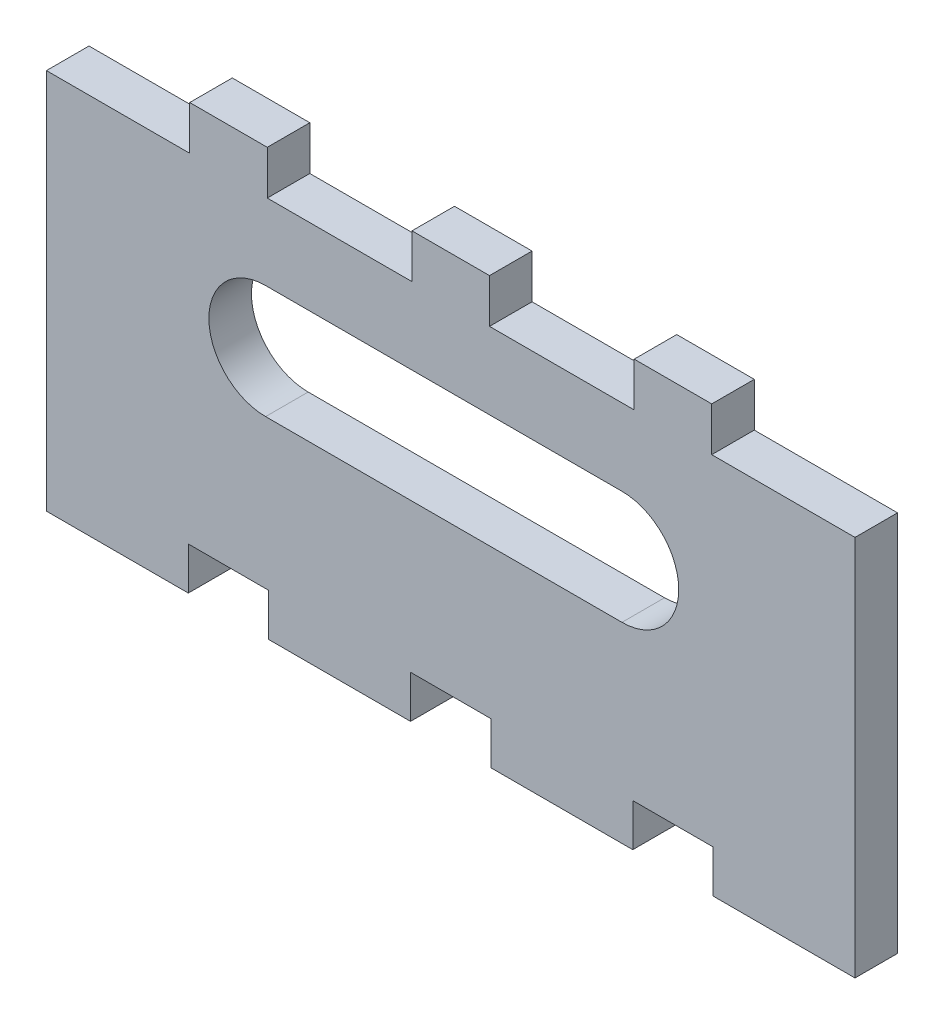
ISO-10303-21;
HEADER;
FILE_DESCRIPTION(('STEP AP214'),'2;1');
FILE_NAME('part.step','',(''),(''),'','','');
FILE_SCHEMA(('AUTOMOTIVE_DESIGN { 1 0 10303 214 1 1 1 1 }'));
ENDSEC;
DATA;
#1=APPLICATION_CONTEXT('core data for automotive mechanical design processes');
#2=APPLICATION_PROTOCOL_DEFINITION('international standard','automotive_design',2000,#1);
#3=PRODUCT_CONTEXT('',#1,'mechanical');
#4=PRODUCT('Part','Part','',(#3));
#5=PRODUCT_RELATED_PRODUCT_CATEGORY('part','',(#4));
#6=PRODUCT_DEFINITION_FORMATION('','',#4);
#7=PRODUCT_DEFINITION_CONTEXT('part definition',#1,'design');
#8=PRODUCT_DEFINITION('design','',#6,#7);
#9=PRODUCT_DEFINITION_SHAPE('','',#8);
#10=(LENGTH_UNIT() NAMED_UNIT(*) SI_UNIT(.MILLI.,.METRE.));
#11=(NAMED_UNIT(*) PLANE_ANGLE_UNIT() SI_UNIT($,.RADIAN.));
#12=(NAMED_UNIT(*) SI_UNIT($,.STERADIAN.) SOLID_ANGLE_UNIT());
#13=UNCERTAINTY_MEASURE_WITH_UNIT(LENGTH_MEASURE(1.E-05),#10,'distance_accuracy_value','');
#14=(GEOMETRIC_REPRESENTATION_CONTEXT(3) GLOBAL_UNCERTAINTY_ASSIGNED_CONTEXT((#13)) GLOBAL_UNIT_ASSIGNED_CONTEXT((#10,
#11,#12)) REPRESENTATION_CONTEXT('',''));
#15=CARTESIAN_POINT('',(0.,0.,0.));
#16=DIRECTION('',(0.,0.,1.));
#17=DIRECTION('',(1.,0.,0.));
#18=AXIS2_PLACEMENT_3D('',#15,#16,#17);
#19=CARTESIAN_POINT('',(0.,0.,-3.));
#20=DIRECTION('',(-1.,0.,0.));
#21=DIRECTION('',(0.,0.,1.));
#22=AXIS2_PLACEMENT_3D('',#19,#20,#21);
#23=PLANE('',#22);
#24=DIRECTION('',(0.,-1.,0.));
#25=VECTOR('',#24,1.);
#26=CARTESIAN_POINT('',(0.,0.,0.));
#27=LINE('',#26,#25);
#28=CARTESIAN_POINT('',(0.,23.9000000000001,0.));
#29=VERTEX_POINT('',#28);
#30=CARTESIAN_POINT('',(0.,-3.00000000000012,0.));
#31=VERTEX_POINT('',#30);
#32=EDGE_CURVE('E542',#29,#31,#27,.T.);
#33=ORIENTED_EDGE('',*,*,#32,.F.);
#34=DIRECTION('',(0.,0.,-1.));
#35=VECTOR('',#34,1.);
#36=CARTESIAN_POINT('',(0.,23.9000000000001,-3.));
#37=LINE('',#36,#35);
#38=CARTESIAN_POINT('',(0.,23.9000000000001,-3.));
#39=VERTEX_POINT('',#38);
#40=EDGE_CURVE('E327',#29,#39,#37,.T.);
#41=ORIENTED_EDGE('',*,*,#40,.T.);
#42=DIRECTION('',(0.,-1.,0.));
#43=VECTOR('',#42,1.);
#44=CARTESIAN_POINT('',(0.,0.,-3.));
#45=LINE('',#44,#43);
#46=CARTESIAN_POINT('',(0.,-3.00000000000013,-3.));
#47=VERTEX_POINT('',#46);
#48=EDGE_CURVE('E556',#39,#47,#45,.T.);
#49=ORIENTED_EDGE('',*,*,#48,.T.);
#50=DIRECTION('',(0.,0.,-1.));
#51=VECTOR('',#50,1.);
#52=CARTESIAN_POINT('',(0.,-3.00000000000012,0.));
#53=LINE('',#52,#51);
#54=EDGE_CURVE('E430',#31,#47,#53,.T.);
#55=ORIENTED_EDGE('',*,*,#54,.F.);
#56=EDGE_LOOP('',(#33,#41,#49,#55));
#57=FACE_BOUND('',#56,.T.);
#58=ADVANCED_FACE('F72',(#57),#23,.T.);
#59=CARTESIAN_POINT('',(0.,27.,-3.));
#60=DIRECTION('',(0.,1.,0.));
#61=DIRECTION('',(0.,0.,1.));
#62=AXIS2_PLACEMENT_3D('',#59,#60,#61);
#63=PLANE('',#62);
#64=DIRECTION('',(-1.,0.,0.));
#65=VECTOR('',#64,1.);
#66=CARTESIAN_POINT('',(0.,27.,0.));
#67=LINE('',#66,#65);
#68=CARTESIAN_POINT('',(46.9000000000004,27.,0.));
#69=VERTEX_POINT('',#68);
#70=CARTESIAN_POINT('',(41.4333333333337,27.,0.));
#71=VERTEX_POINT('',#70);
#72=EDGE_CURVE('E559',#69,#71,#67,.T.);
#73=ORIENTED_EDGE('',*,*,#72,.F.);
#74=DIRECTION('',(0.,0.,-1.));
#75=VECTOR('',#74,1.);
#76=CARTESIAN_POINT('',(46.9000000000004,27.,-3.));
#77=LINE('',#76,#75);
#78=CARTESIAN_POINT('',(46.9000000000004,27.,-3.));
#79=VERTEX_POINT('',#78);
#80=EDGE_CURVE('E420',#69,#79,#77,.T.);
#81=ORIENTED_EDGE('',*,*,#80,.T.);
#82=DIRECTION('',(-1.,0.,0.));
#83=VECTOR('',#82,1.);
#84=CARTESIAN_POINT('',(0.,27.,-3.));
#85=LINE('',#84,#83);
#86=CARTESIAN_POINT('',(41.4333333333337,27.,-3.));
#87=VERTEX_POINT('',#86);
#88=EDGE_CURVE('E570',#79,#87,#85,.T.);
#89=ORIENTED_EDGE('',*,*,#88,.T.);
#90=DIRECTION('',(0.,0.,1.));
#91=VECTOR('',#90,1.);
#92=CARTESIAN_POINT('',(41.4333333333337,27.,-3.));
#93=LINE('',#92,#91);
#94=EDGE_CURVE('E411',#87,#71,#93,.T.);
#95=ORIENTED_EDGE('',*,*,#94,.T.);
#96=EDGE_LOOP('',(#73,#81,#89,#95));
#97=FACE_BOUND('',#96,.T.);
#98=ADVANCED_FACE('F596',(#97),#63,.T.);
#99=CARTESIAN_POINT('',(31.2333333333337,27.,0.));
#100=VERTEX_POINT('',#99);
#101=CARTESIAN_POINT('',(25.7666666666671,27.,0.));
#102=VERTEX_POINT('',#101);
#103=EDGE_CURVE('E582',#100,#102,#67,.T.);
#104=ORIENTED_EDGE('',*,*,#103,.F.);
#105=DIRECTION('',(0.,0.,-1.));
#106=VECTOR('',#105,1.);
#107=CARTESIAN_POINT('',(31.2333333333337,27.,-3.));
#108=LINE('',#107,#106);
#109=CARTESIAN_POINT('',(31.2333333333337,27.,-3.));
#110=VERTEX_POINT('',#109);
#111=EDGE_CURVE('E414',#100,#110,#108,.T.);
#112=ORIENTED_EDGE('',*,*,#111,.T.);
#113=CARTESIAN_POINT('',(25.7666666666671,27.,-3.));
#114=VERTEX_POINT('',#113);
#115=EDGE_CURVE('E569',#110,#114,#85,.T.);
#116=ORIENTED_EDGE('',*,*,#115,.T.);
#117=DIRECTION('',(0.,0.,1.));
#118=VECTOR('',#117,1.);
#119=CARTESIAN_POINT('',(25.7666666666671,27.,-3.));
#120=LINE('',#119,#118);
#121=EDGE_CURVE('E405',#114,#102,#120,.T.);
#122=ORIENTED_EDGE('',*,*,#121,.T.);
#123=EDGE_LOOP('',(#104,#112,#116,#122));
#124=FACE_BOUND('',#123,.T.);
#125=ADVANCED_FACE('F603',(#124),#63,.T.);
#126=CARTESIAN_POINT('',(15.5666666666671,27.,0.));
#127=VERTEX_POINT('',#126);
#128=CARTESIAN_POINT('',(10.1000000000004,27.,0.));
#129=VERTEX_POINT('',#128);
#130=EDGE_CURVE('E579',#127,#129,#67,.T.);
#131=ORIENTED_EDGE('',*,*,#130,.F.);
#132=DIRECTION('',(0.,0.,-1.));
#133=VECTOR('',#132,1.);
#134=CARTESIAN_POINT('',(15.5666666666671,27.,-3.));
#135=LINE('',#134,#133);
#136=CARTESIAN_POINT('',(15.5666666666671,27.,-3.));
#137=VERTEX_POINT('',#136);
#138=EDGE_CURVE('E408',#127,#137,#135,.T.);
#139=ORIENTED_EDGE('',*,*,#138,.T.);
#140=CARTESIAN_POINT('',(10.1000000000004,27.,-3.));
#141=VERTEX_POINT('',#140);
#142=EDGE_CURVE('E566',#137,#141,#85,.T.);
#143=ORIENTED_EDGE('',*,*,#142,.T.);
#144=DIRECTION('',(0.,0.,1.));
#145=VECTOR('',#144,1.);
#146=CARTESIAN_POINT('',(10.1000000000004,27.,-3.));
#147=LINE('',#146,#145);
#148=EDGE_CURVE('E402',#141,#129,#147,.T.);
#149=ORIENTED_EDGE('',*,*,#148,.T.);
#150=EDGE_LOOP('',(#131,#139,#143,#149));
#151=FACE_BOUND('',#150,.T.);
#152=ADVANCED_FACE('F623',(#151),#63,.T.);
#153=CARTESIAN_POINT('',(57.,0.,-3.));
#154=DIRECTION('',(1.,0.,0.));
#155=DIRECTION('',(0.,0.,-1.));
#156=AXIS2_PLACEMENT_3D('',#153,#154,#155);
#157=PLANE('',#156);
#158=DIRECTION('',(0.,1.,0.));
#159=VECTOR('',#158,1.);
#160=CARTESIAN_POINT('',(57.,0.,-3.));
#161=LINE('',#160,#159);
#162=CARTESIAN_POINT('',(57.,-3.00000000000031,-3.));
#163=VERTEX_POINT('',#162);
#164=CARTESIAN_POINT('',(57.,23.8999999999999,-3.));
#165=VERTEX_POINT('',#164);
#166=EDGE_CURVE('E562',#163,#165,#161,.T.);
#167=ORIENTED_EDGE('',*,*,#166,.T.);
#168=DIRECTION('',(0.,0.,1.));
#169=VECTOR('',#168,1.);
#170=CARTESIAN_POINT('',(57.,23.8999999999999,-3.));
#171=LINE('',#170,#169);
#172=CARTESIAN_POINT('',(57.,23.8999999999999,0.));
#173=VERTEX_POINT('',#172);
#174=EDGE_CURVE('E417',#165,#173,#171,.T.);
#175=ORIENTED_EDGE('',*,*,#174,.T.);
#176=DIRECTION('',(0.,1.,0.));
#177=VECTOR('',#176,1.);
#178=CARTESIAN_POINT('',(57.,0.,0.));
#179=LINE('',#178,#177);
#180=CARTESIAN_POINT('',(57.,-3.00000000000031,0.));
#181=VERTEX_POINT('',#180);
#182=EDGE_CURVE('E575',#181,#173,#179,.T.);
#183=ORIENTED_EDGE('',*,*,#182,.F.);
#184=DIRECTION('',(0.,0.,1.));
#185=VECTOR('',#184,1.);
#186=CARTESIAN_POINT('',(57.,-3.00000000000031,-2.99999999999999));
#187=LINE('',#186,#185);
#188=EDGE_CURVE('E546',#163,#181,#187,.T.);
#189=ORIENTED_EDGE('',*,*,#188,.F.);
#190=EDGE_LOOP('',(#167,#175,#183,#189));
#191=FACE_BOUND('',#190,.T.);
#192=ADVANCED_FACE('F683',(#191),#157,.T.);
#193=CARTESIAN_POINT('',(0.,0.,-3.));
#194=DIRECTION('',(0.,0.,-1.));
#195=DIRECTION('',(-1.,0.,0.));
#196=AXIS2_PLACEMENT_3D('',#193,#194,#195);
#197=PLANE('',#196);
#198=CARTESIAN_POINT('',(15.4510094735736,14.4999999999998,-3.));
#199=DIRECTION('',(0.,0.,-1.));
#200=DIRECTION('',(-1.,0.,0.));
#201=AXIS2_PLACEMENT_3D('',#198,#199,#200);
#202=CIRCLE('',#201,4.);
#203=CARTESIAN_POINT('',(15.4510094735736,10.4999999999998,-3.));
#204=VERTEX_POINT('',#203);
#205=CARTESIAN_POINT('',(15.4510094735736,18.4999999999998,-3.));
#206=VERTEX_POINT('',#205);
#207=EDGE_CURVE('E312',#204,#206,#202,.T.);
#208=ORIENTED_EDGE('',*,*,#207,.F.);
#209=DIRECTION('',(-1.,0.,0.));
#210=VECTOR('',#209,1.);
#211=CARTESIAN_POINT('',(0.,10.4999999999998,-3.));
#212=LINE('',#211,#210);
#213=CARTESIAN_POINT('',(40.5725214914912,10.4999999999998,-3.));
#214=VERTEX_POINT('',#213);
#215=EDGE_CURVE('E305',#214,#204,#212,.T.);
#216=ORIENTED_EDGE('',*,*,#215,.F.);
#217=CARTESIAN_POINT('',(40.5725214914912,14.4999999999998,-3.));
#218=DIRECTION('',(0.,0.,-1.));
#219=DIRECTION('',(-1.,0.,0.));
#220=AXIS2_PLACEMENT_3D('',#217,#218,#219);
#221=CIRCLE('',#220,4.);
#222=CARTESIAN_POINT('',(40.5725214914912,18.4999999999998,-3.));
#223=VERTEX_POINT('',#222);
#224=EDGE_CURVE('E285',#223,#214,#221,.T.);
#225=ORIENTED_EDGE('',*,*,#224,.F.);
#226=DIRECTION('',(1.,0.,0.));
#227=VECTOR('',#226,1.);
#228=CARTESIAN_POINT('',(0.,18.4999999999998,-3.));
#229=LINE('',#228,#227);
#230=EDGE_CURVE('E310',#206,#223,#229,.T.);
#231=ORIENTED_EDGE('',*,*,#230,.F.);
#232=EDGE_LOOP('',(#208,#216,#225,#231));
#233=FACE_BOUND('',#232,.T.);
#234=ORIENTED_EDGE('',*,*,#88,.F.);
#235=DIRECTION('',(0.,1.,0.));
#236=VECTOR('',#235,1.);
#237=CARTESIAN_POINT('',(46.9000000000004,23.8999999999999,-3.));
#238=LINE('',#237,#236);
#239=CARTESIAN_POINT('',(46.9000000000004,23.8999999999999,-3.));
#240=VERTEX_POINT('',#239);
#241=EDGE_CURVE('E322',#240,#79,#238,.T.);
#242=ORIENTED_EDGE('',*,*,#241,.F.);
#243=DIRECTION('',(-1.,0.,0.));
#244=VECTOR('',#243,1.);
#245=CARTESIAN_POINT('',(57.1000000000004,23.8999999999999,-3.));
#246=LINE('',#245,#244);
#247=EDGE_CURVE('E320',#165,#240,#246,.T.);
#248=ORIENTED_EDGE('',*,*,#247,.F.);
#249=ORIENTED_EDGE('',*,*,#166,.F.);
#250=DIRECTION('',(1.,0.,0.));
#251=VECTOR('',#250,1.);
#252=CARTESIAN_POINT('',(47.,-3.00000000000028,-3.));
#253=LINE('',#252,#251);
#254=CARTESIAN_POINT('',(47.,-3.00000000000029,-3.));
#255=VERTEX_POINT('',#254);
#256=EDGE_CURVE('E549',#255,#163,#253,.T.);
#257=ORIENTED_EDGE('',*,*,#256,.F.);
#258=DIRECTION('',(0.,1.,0.));
#259=VECTOR('',#258,1.);
#260=CARTESIAN_POINT('',(47.,-6.00000000000059,-3.));
#261=LINE('',#260,#259);
#262=CARTESIAN_POINT('',(47.,0.,-3.));
#263=VERTEX_POINT('',#262);
#264=EDGE_CURVE('E535',#255,#263,#261,.T.);
#265=ORIENTED_EDGE('',*,*,#264,.T.);
#266=DIRECTION('',(1.,0.,0.));
#267=VECTOR('',#266,1.);
#268=CARTESIAN_POINT('',(0.,0.,-3.));
#269=LINE('',#268,#267);
#270=CARTESIAN_POINT('',(41.3333333333333,0.,-3.));
#271=VERTEX_POINT('',#270);
#272=EDGE_CURVE('E558',#271,#263,#269,.T.);
#273=ORIENTED_EDGE('',*,*,#272,.F.);
#274=DIRECTION('',(0.,1.,0.));
#275=VECTOR('',#274,1.);
#276=CARTESIAN_POINT('',(41.3333333333333,-6.00000000000048,-3.));
#277=LINE('',#276,#275);
#278=CARTESIAN_POINT('',(41.3333333333333,-3.00000000000026,-3.));
#279=VERTEX_POINT('',#278);
#280=EDGE_CURVE('E472',#279,#271,#277,.T.);
#281=ORIENTED_EDGE('',*,*,#280,.F.);
#282=DIRECTION('',(1.,0.,0.));
#283=VECTOR('',#282,1.);
#284=CARTESIAN_POINT('',(31.3333333333333,-3.00000000000022,-3.));
#285=LINE('',#284,#283);
#286=CARTESIAN_POINT('',(31.3333333333333,-3.00000000000024,-3.));
#287=VERTEX_POINT('',#286);
#288=EDGE_CURVE('E519',#287,#279,#285,.T.);
#289=ORIENTED_EDGE('',*,*,#288,.F.);
#290=DIRECTION('',(0.,1.,0.));
#291=VECTOR('',#290,1.);
#292=CARTESIAN_POINT('',(31.3333333333333,-6.00000000000048,-3.));
#293=LINE('',#292,#291);
#294=CARTESIAN_POINT('',(31.3333333333333,0.,-3.));
#295=VERTEX_POINT('',#294);
#296=EDGE_CURVE('E495',#287,#295,#293,.T.);
#297=ORIENTED_EDGE('',*,*,#296,.T.);
#298=CARTESIAN_POINT('',(25.6666666666667,0.,-3.));
#299=VERTEX_POINT('',#298);
#300=EDGE_CURVE('E563',#299,#295,#269,.T.);
#301=ORIENTED_EDGE('',*,*,#300,.F.);
#302=DIRECTION('',(0.,1.,0.));
#303=VECTOR('',#302,1.);
#304=CARTESIAN_POINT('',(25.6666666666667,-6.00000000000037,-3.));
#305=LINE('',#304,#303);
#306=CARTESIAN_POINT('',(25.6666666666667,-3.0000000000002,-3.));
#307=VERTEX_POINT('',#306);
#308=EDGE_CURVE('E436',#307,#299,#305,.T.);
#309=ORIENTED_EDGE('',*,*,#308,.F.);
#310=DIRECTION('',(1.,0.,0.));
#311=VECTOR('',#310,1.);
#312=CARTESIAN_POINT('',(15.6666666666667,-3.00000000000017,-3.));
#313=LINE('',#312,#311);
#314=CARTESIAN_POINT('',(15.6666666666667,-3.00000000000019,-3.));
#315=VERTEX_POINT('',#314);
#316=EDGE_CURVE('E479',#315,#307,#313,.T.);
#317=ORIENTED_EDGE('',*,*,#316,.F.);
#318=DIRECTION('',(0.,1.,0.));
#319=VECTOR('',#318,1.);
#320=CARTESIAN_POINT('',(15.6666666666667,-6.00000000000037,-3.));
#321=LINE('',#320,#319);
#322=CARTESIAN_POINT('',(15.6666666666667,0.,-3.));
#323=VERTEX_POINT('',#322);
#324=EDGE_CURVE('E455',#315,#323,#321,.T.);
#325=ORIENTED_EDGE('',*,*,#324,.T.);
#326=CARTESIAN_POINT('',(10.,0.,-3.));
#327=VERTEX_POINT('',#326);
#328=EDGE_CURVE('E560',#327,#323,#269,.T.);
#329=ORIENTED_EDGE('',*,*,#328,.F.);
#330=DIRECTION('',(0.,1.,0.));
#331=VECTOR('',#330,1.);
#332=CARTESIAN_POINT('',(10.,-6.00000000000026,-3.));
#333=LINE('',#332,#331);
#334=CARTESIAN_POINT('',(10.,-3.00000000000015,-3.));
#335=VERTEX_POINT('',#334);
#336=EDGE_CURVE('E423',#335,#327,#333,.T.);
#337=ORIENTED_EDGE('',*,*,#336,.F.);
#338=DIRECTION('',(1.,0.,0.));
#339=VECTOR('',#338,1.);
#340=CARTESIAN_POINT('',(0.,-3.00000000000011,-3.));
#341=LINE('',#340,#339);
#342=EDGE_CURVE('E443',#47,#335,#341,.T.);
#343=ORIENTED_EDGE('',*,*,#342,.F.);
#344=ORIENTED_EDGE('',*,*,#48,.F.);
#345=DIRECTION('',(-1.,0.,0.));
#346=VECTOR('',#345,1.);
#347=CARTESIAN_POINT('',(10.1000000000004,23.9000000000001,-3.));
#348=LINE('',#347,#346);
#349=CARTESIAN_POINT('',(10.1000000000004,23.9000000000001,-3.));
#350=VERTEX_POINT('',#349);
#351=EDGE_CURVE('E393',#350,#39,#348,.T.);
#352=ORIENTED_EDGE('',*,*,#351,.F.);
#353=DIRECTION('',(0.,-1.,0.));
#354=VECTOR('',#353,1.);
#355=CARTESIAN_POINT('',(10.1000000000004,27.1000000000001,-3.));
#356=LINE('',#355,#354);
#357=EDGE_CURVE('E387',#141,#350,#356,.T.);
#358=ORIENTED_EDGE('',*,*,#357,.F.);
#359=ORIENTED_EDGE('',*,*,#142,.F.);
#360=DIRECTION('',(0.,1.,0.));
#361=VECTOR('',#360,1.);
#362=CARTESIAN_POINT('',(15.5666666666671,23.9000000000001,-3.));
#363=LINE('',#362,#361);
#364=CARTESIAN_POINT('',(15.5666666666671,23.9000000000001,-3.));
#365=VERTEX_POINT('',#364);
#366=EDGE_CURVE('E380',#365,#137,#363,.T.);
#367=ORIENTED_EDGE('',*,*,#366,.F.);
#368=DIRECTION('',(-1.,0.,0.));
#369=VECTOR('',#368,1.);
#370=CARTESIAN_POINT('',(25.7666666666671,23.9,-3.));
#371=LINE('',#370,#369);
#372=CARTESIAN_POINT('',(25.7666666666671,23.9,-3.));
#373=VERTEX_POINT('',#372);
#374=EDGE_CURVE('E365',#373,#365,#371,.T.);
#375=ORIENTED_EDGE('',*,*,#374,.F.);
#376=DIRECTION('',(0.,-1.,0.));
#377=VECTOR('',#376,1.);
#378=CARTESIAN_POINT('',(25.7666666666671,27.1,-3.));
#379=LINE('',#378,#377);
#380=EDGE_CURVE('E359',#114,#373,#379,.T.);
#381=ORIENTED_EDGE('',*,*,#380,.F.);
#382=ORIENTED_EDGE('',*,*,#115,.F.);
#383=DIRECTION('',(0.,1.,0.));
#384=VECTOR('',#383,1.);
#385=CARTESIAN_POINT('',(31.2333333333337,23.9,-3.));
#386=LINE('',#385,#384);
#387=CARTESIAN_POINT('',(31.2333333333337,23.9,-3.));
#388=VERTEX_POINT('',#387);
#389=EDGE_CURVE('E352',#388,#110,#386,.T.);
#390=ORIENTED_EDGE('',*,*,#389,.F.);
#391=DIRECTION('',(-1.,0.,0.));
#392=VECTOR('',#391,1.);
#393=CARTESIAN_POINT('',(41.4333333333337,23.9,-3.));
#394=LINE('',#393,#392);
#395=CARTESIAN_POINT('',(41.4333333333337,23.9,-3.));
#396=VERTEX_POINT('',#395);
#397=EDGE_CURVE('E337',#396,#388,#394,.T.);
#398=ORIENTED_EDGE('',*,*,#397,.F.);
#399=DIRECTION('',(0.,-1.,0.));
#400=VECTOR('',#399,1.);
#401=CARTESIAN_POINT('',(41.4333333333337,27.1,-3.));
#402=LINE('',#401,#400);
#403=EDGE_CURVE('E331',#87,#396,#402,.T.);
#404=ORIENTED_EDGE('',*,*,#403,.F.);
#405=EDGE_LOOP('',(#234,#242,#248,#249,#257,#265,#273,#281,#289,#297,#301,#309,#317,#325,#329,
#337,#343,#344,#352,#358,#359,#367,#375,#381,#382,#390,#398,#404));
#406=FACE_BOUND('',#405,.T.);
#407=ADVANCED_FACE('F612',(#233,#406),#197,.T.);
#408=CARTESIAN_POINT('',(0.,0.,0.));
#409=DIRECTION('',(0.,0.,-1.));
#410=DIRECTION('',(-1.,0.,0.));
#411=AXIS2_PLACEMENT_3D('',#408,#409,#410);
#412=PLANE('',#411);
#413=DIRECTION('',(1.,0.,0.));
#414=VECTOR('',#413,1.);
#415=CARTESIAN_POINT('',(15.4510094735736,10.4999999999998,0.));
#416=LINE('',#415,#414);
#417=CARTESIAN_POINT('',(15.4510094735736,10.4999999999998,0.));
#418=VERTEX_POINT('',#417);
#419=CARTESIAN_POINT('',(40.5725214914912,10.4999999999998,0.));
#420=VERTEX_POINT('',#419);
#421=EDGE_CURVE('E291',#418,#420,#416,.T.);
#422=ORIENTED_EDGE('',*,*,#421,.F.);
#423=CARTESIAN_POINT('',(15.4510094735736,14.4999999999998,0.));
#424=DIRECTION('',(0.,0.,1.));
#425=DIRECTION('',(1.,0.,0.));
#426=AXIS2_PLACEMENT_3D('',#423,#424,#425);
#427=CIRCLE('',#426,4.);
#428=CARTESIAN_POINT('',(15.4510094735736,18.4999999999998,0.));
#429=VERTEX_POINT('',#428);
#430=EDGE_CURVE('E94',#429,#418,#427,.T.);
#431=ORIENTED_EDGE('',*,*,#430,.F.);
#432=DIRECTION('',(-1.,0.,0.));
#433=VECTOR('',#432,1.);
#434=CARTESIAN_POINT('',(15.4510094735736,18.4999999999998,0.));
#435=LINE('',#434,#433);
#436=CARTESIAN_POINT('',(40.5725214914912,18.4999999999998,0.));
#437=VERTEX_POINT('',#436);
#438=EDGE_CURVE('E298',#437,#429,#435,.T.);
#439=ORIENTED_EDGE('',*,*,#438,.F.);
#440=CARTESIAN_POINT('',(40.5725214914912,14.4999999999998,0.));
#441=DIRECTION('',(0.,0.,1.));
#442=DIRECTION('',(1.,0.,0.));
#443=AXIS2_PLACEMENT_3D('',#440,#441,#442);
#444=CIRCLE('',#443,4.);
#445=EDGE_CURVE('E282',#420,#437,#444,.T.);
#446=ORIENTED_EDGE('',*,*,#445,.F.);
#447=EDGE_LOOP('',(#422,#431,#439,#446));
#448=FACE_BOUND('',#447,.T.);
#449=CARTESIAN_POINT('',(46.9000000000004,23.8999999999999,0.));
#450=CARTESIAN_POINT('',(46.9000000000004,27.0999999999999,0.));
#451=B_SPLINE_CURVE_WITH_KNOTS('',1,(#449,#450),.UNSPECIFIED.,.F.,.F.,(2,2),(0.,
0.119402985074627),.UNSPECIFIED.);
#452=CARTESIAN_POINT('',(46.9000000000004,23.8999999999999,0.));
#453=VERTEX_POINT('',#452);
#454=EDGE_CURVE('E315',#453,#69,#451,.T.);
#455=ORIENTED_EDGE('',*,*,#454,.T.);
#456=ORIENTED_EDGE('',*,*,#72,.T.);
#457=DIRECTION('',(0.,1.,0.));
#458=VECTOR('',#457,1.);
#459=CARTESIAN_POINT('',(41.4333333333337,-1.44663710139402E-13,0.));
#460=LINE('',#459,#458);
#461=CARTESIAN_POINT('',(41.4333333333337,23.9,0.));
#462=VERTEX_POINT('',#461);
#463=EDGE_CURVE('E79',#462,#71,#460,.T.);
#464=ORIENTED_EDGE('',*,*,#463,.F.);
#465=CARTESIAN_POINT('',(41.4333333333337,23.9,0.));
#466=CARTESIAN_POINT('',(31.2333333333337,23.9,0.));
#467=B_SPLINE_CURVE_WITH_KNOTS('',1,(#465,#466),.UNSPECIFIED.,.F.,.F.,(2,2),(0.619402985074627,
1.),.UNSPECIFIED.);
#468=CARTESIAN_POINT('',(31.2333333333337,23.9,0.));
#469=VERTEX_POINT('',#468);
#470=EDGE_CURVE('E332',#462,#469,#467,.T.);
#471=ORIENTED_EDGE('',*,*,#470,.T.);
#472=CARTESIAN_POINT('',(31.2333333333337,23.9,0.));
#473=CARTESIAN_POINT('',(31.2333333333337,27.1,0.));
#474=B_SPLINE_CURVE_WITH_KNOTS('',1,(#472,#473),.UNSPECIFIED.,.F.,.F.,(2,2),(0.,
0.119402985074627),.UNSPECIFIED.);
#475=EDGE_CURVE('E339',#469,#100,#474,.T.);
#476=ORIENTED_EDGE('',*,*,#475,.T.);
#477=ORIENTED_EDGE('',*,*,#103,.T.);
#478=DIRECTION('',(0.,1.,0.));
#479=VECTOR('',#478,1.);
#480=CARTESIAN_POINT('',(25.766666666667,0.,0.));
#481=LINE('',#480,#479);
#482=CARTESIAN_POINT('',(25.7666666666671,23.9,0.));
#483=VERTEX_POINT('',#482);
#484=EDGE_CURVE('E585',#483,#102,#481,.T.);
#485=ORIENTED_EDGE('',*,*,#484,.F.);
#486=CARTESIAN_POINT('',(25.7666666666671,23.9,0.));
#487=CARTESIAN_POINT('',(15.5666666666671,23.9000000000001,0.));
#488=B_SPLINE_CURVE_WITH_KNOTS('',1,(#486,#487),.UNSPECIFIED.,.F.,.F.,(2,2),(0.619402985074627,
1.),.UNSPECIFIED.);
#489=CARTESIAN_POINT('',(15.5666666666671,23.9000000000001,0.));
#490=VERTEX_POINT('',#489);
#491=EDGE_CURVE('E360',#483,#490,#488,.T.);
#492=ORIENTED_EDGE('',*,*,#491,.T.);
#493=CARTESIAN_POINT('',(15.5666666666671,23.9000000000001,0.));
#494=CARTESIAN_POINT('',(15.5666666666671,27.1000000000001,0.));
#495=B_SPLINE_CURVE_WITH_KNOTS('',1,(#493,#494),.UNSPECIFIED.,.F.,.F.,(2,2),(0.,
0.119402985074627),.UNSPECIFIED.);
#496=EDGE_CURVE('E367',#490,#127,#495,.T.);
#497=ORIENTED_EDGE('',*,*,#496,.T.);
#498=ORIENTED_EDGE('',*,*,#130,.T.);
#499=DIRECTION('',(0.,1.,0.));
#500=VECTOR('',#499,1.);
#501=CARTESIAN_POINT('',(10.1000000000003,0.,0.));
#502=LINE('',#501,#500);
#503=CARTESIAN_POINT('',(10.1000000000004,23.9000000000001,0.));
#504=VERTEX_POINT('',#503);
#505=EDGE_CURVE('E583',#504,#129,#502,.T.);
#506=ORIENTED_EDGE('',*,*,#505,.F.);
#507=CARTESIAN_POINT('',(10.1000000000004,23.9000000000001,0.));
#508=CARTESIAN_POINT('',(-0.0999999999995865,23.9000000000001,0.));
#509=B_SPLINE_CURVE_WITH_KNOTS('',1,(#507,#508),.UNSPECIFIED.,.F.,.F.,(2,2),(0.619402985074627,
1.),.UNSPECIFIED.);
#510=EDGE_CURVE('E388',#504,#29,#509,.T.);
#511=ORIENTED_EDGE('',*,*,#510,.T.);
#512=ORIENTED_EDGE('',*,*,#32,.T.);
#513=DIRECTION('',(-1.,0.,0.));
#514=VECTOR('',#513,1.);
#515=CARTESIAN_POINT('',(10.,-3.00000000000016,0.));
#516=LINE('',#515,#514);
#517=CARTESIAN_POINT('',(10.,-3.00000000000014,0.));
#518=VERTEX_POINT('',#517);
#519=EDGE_CURVE('E437',#518,#31,#516,.T.);
#520=ORIENTED_EDGE('',*,*,#519,.F.);
#521=DIRECTION('',(0.,1.,0.));
#522=VECTOR('',#521,1.);
#523=CARTESIAN_POINT('',(10.,-6.00000000000026,0.));
#524=LINE('',#523,#522);
#525=CARTESIAN_POINT('',(10.,0.,0.));
#526=VERTEX_POINT('',#525);
#527=EDGE_CURVE('E429',#518,#526,#524,.T.);
#528=ORIENTED_EDGE('',*,*,#527,.T.);
#529=DIRECTION('',(1.,0.,0.));
#530=VECTOR('',#529,1.);
#531=CARTESIAN_POINT('',(0.,0.,0.));
#532=LINE('',#531,#530);
#533=CARTESIAN_POINT('',(15.6666666666667,0.,0.));
#534=VERTEX_POINT('',#533);
#535=EDGE_CURVE('E573',#526,#534,#532,.T.);
#536=ORIENTED_EDGE('',*,*,#535,.T.);
#537=DIRECTION('',(0.,1.,0.));
#538=VECTOR('',#537,1.);
#539=CARTESIAN_POINT('',(15.6666666666667,-6.00000000000037,0.));
#540=LINE('',#539,#538);
#541=CARTESIAN_POINT('',(15.6666666666667,-3.00000000000017,0.));
#542=VERTEX_POINT('',#541);
#543=EDGE_CURVE('E456',#542,#534,#540,.T.);
#544=ORIENTED_EDGE('',*,*,#543,.F.);
#545=DIRECTION('',(-1.,0.,0.));
#546=VECTOR('',#545,1.);
#547=CARTESIAN_POINT('',(25.6666666666667,-3.00000000000021,0.));
#548=LINE('',#547,#546);
#549=CARTESIAN_POINT('',(25.6666666666667,-3.0000000000002,0.));
#550=VERTEX_POINT('',#549);
#551=EDGE_CURVE('E473',#550,#542,#548,.T.);
#552=ORIENTED_EDGE('',*,*,#551,.F.);
#553=DIRECTION('',(0.,1.,0.));
#554=VECTOR('',#553,1.);
#555=CARTESIAN_POINT('',(25.6666666666667,-6.00000000000037,0.));
#556=LINE('',#555,#554);
#557=CARTESIAN_POINT('',(25.6666666666667,0.,0.));
#558=VERTEX_POINT('',#557);
#559=EDGE_CURVE('E465',#550,#558,#556,.T.);
#560=ORIENTED_EDGE('',*,*,#559,.T.);
#561=CARTESIAN_POINT('',(31.3333333333333,0.,0.));
#562=VERTEX_POINT('',#561);
#563=EDGE_CURVE('E576',#558,#562,#532,.T.);
#564=ORIENTED_EDGE('',*,*,#563,.T.);
#565=DIRECTION('',(0.,1.,0.));
#566=VECTOR('',#565,1.);
#567=CARTESIAN_POINT('',(31.3333333333333,-6.00000000000048,0.));
#568=LINE('',#567,#566);
#569=CARTESIAN_POINT('',(31.3333333333333,-3.00000000000023,0.));
#570=VERTEX_POINT('',#569);
#571=EDGE_CURVE('E496',#570,#562,#568,.T.);
#572=ORIENTED_EDGE('',*,*,#571,.F.);
#573=DIRECTION('',(-1.,0.,0.));
#574=VECTOR('',#573,1.);
#575=CARTESIAN_POINT('',(41.3333333333333,-3.00000000000027,0.));
#576=LINE('',#575,#574);
#577=CARTESIAN_POINT('',(41.3333333333333,-3.00000000000025,0.));
#578=VERTEX_POINT('',#577);
#579=EDGE_CURVE('E513',#578,#570,#576,.T.);
#580=ORIENTED_EDGE('',*,*,#579,.F.);
#581=DIRECTION('',(0.,1.,0.));
#582=VECTOR('',#581,1.);
#583=CARTESIAN_POINT('',(41.3333333333333,-6.00000000000048,0.));
#584=LINE('',#583,#582);
#585=CARTESIAN_POINT('',(41.3333333333333,0.,0.));
#586=VERTEX_POINT('',#585);
#587=EDGE_CURVE('E505',#578,#586,#584,.T.);
#588=ORIENTED_EDGE('',*,*,#587,.T.);
#589=CARTESIAN_POINT('',(47.,0.,0.));
#590=VERTEX_POINT('',#589);
#591=EDGE_CURVE('E572',#586,#590,#532,.T.);
#592=ORIENTED_EDGE('',*,*,#591,.T.);
#593=DIRECTION('',(0.,1.,0.));
#594=VECTOR('',#593,1.);
#595=CARTESIAN_POINT('',(47.,-6.00000000000059,0.));
#596=LINE('',#595,#594);
#597=CARTESIAN_POINT('',(47.,-3.00000000000028,0.));
#598=VERTEX_POINT('',#597);
#599=EDGE_CURVE('E512',#598,#590,#596,.T.);
#600=ORIENTED_EDGE('',*,*,#599,.F.);
#601=DIRECTION('',(-1.,0.,0.));
#602=VECTOR('',#601,1.);
#603=CARTESIAN_POINT('',(57.,-3.00000000000032,0.));
#604=LINE('',#603,#602);
#605=EDGE_CURVE('E543',#181,#598,#604,.T.);
#606=ORIENTED_EDGE('',*,*,#605,.F.);
#607=ORIENTED_EDGE('',*,*,#182,.T.);
#608=DIRECTION('',(1.,0.,0.));
#609=VECTOR('',#608,1.);
#610=CARTESIAN_POINT('',(0.,23.9000000000001,0.));
#611=LINE('',#610,#609);
#612=EDGE_CURVE('E13',#453,#173,#611,.T.);
#613=ORIENTED_EDGE('',*,*,#612,.F.);
#614=EDGE_LOOP('',(#455,#456,#464,#471,#476,#477,#485,#492,#497,#498,#506,#511,#512,#520,#528,
#536,#544,#552,#560,#564,#572,#580,#588,#592,#600,#606,#607,#613));
#615=FACE_BOUND('',#614,.T.);
#616=ADVANCED_FACE('F295',(#448,#615),#412,.F.);
#617=CARTESIAN_POINT('',(0.,0.,-3.));
#618=DIRECTION('',(0.,-1.,0.));
#619=DIRECTION('',(0.,0.,-1.));
#620=AXIS2_PLACEMENT_3D('',#617,#618,#619);
#621=PLANE('',#620);
#622=CARTESIAN_POINT('',(25.6666666666667,0.,-3.));
#623=CARTESIAN_POINT('',(25.6666666666667,0.,0.));
#624=B_SPLINE_CURVE_WITH_KNOTS('',1,(#622,#623),.UNSPECIFIED.,.F.,.F.,(2,2),(0.,
0.115384615384615),.UNSPECIFIED.);
#625=EDGE_CURVE('E457',#299,#558,#624,.T.);
#626=ORIENTED_EDGE('',*,*,#625,.F.);
#627=ORIENTED_EDGE('',*,*,#300,.T.);
#628=CARTESIAN_POINT('',(31.3333333333333,0.,0.));
#629=CARTESIAN_POINT('',(31.3333333333333,0.,-3.));
#630=B_SPLINE_CURVE_WITH_KNOTS('',1,(#628,#629),.UNSPECIFIED.,.F.,.F.,(2,2),(0.5,
0.615384615384615),.UNSPECIFIED.);
#631=EDGE_CURVE('E490',#562,#295,#630,.T.);
#632=ORIENTED_EDGE('',*,*,#631,.F.);
#633=ORIENTED_EDGE('',*,*,#563,.F.);
#634=EDGE_LOOP('',(#626,#627,#632,#633));
#635=FACE_BOUND('',#634,.T.);
#636=ADVANCED_FACE('F659',(#635),#621,.T.);
#637=CARTESIAN_POINT('',(41.3333333333333,0.,-3.));
#638=CARTESIAN_POINT('',(41.3333333333333,0.,0.));
#639=B_SPLINE_CURVE_WITH_KNOTS('',1,(#637,#638),.UNSPECIFIED.,.F.,.F.,(2,2),(0.,
0.115384615384615),.UNSPECIFIED.);
#640=EDGE_CURVE('E497',#271,#586,#639,.T.);
#641=ORIENTED_EDGE('',*,*,#640,.F.);
#642=ORIENTED_EDGE('',*,*,#272,.T.);
#643=CARTESIAN_POINT('',(47.,0.,0.));
#644=CARTESIAN_POINT('',(47.,0.,-3.));
#645=B_SPLINE_CURVE_WITH_KNOTS('',1,(#643,#644),.UNSPECIFIED.,.F.,.F.,(2,2),(0.5,
0.615384615384615),.UNSPECIFIED.);
#646=EDGE_CURVE('E530',#590,#263,#645,.T.);
#647=ORIENTED_EDGE('',*,*,#646,.F.);
#648=ORIENTED_EDGE('',*,*,#591,.F.);
#649=EDGE_LOOP('',(#641,#642,#647,#648));
#650=FACE_BOUND('',#649,.T.);
#651=ADVANCED_FACE('F672',(#650),#621,.T.);
#652=CARTESIAN_POINT('',(10.,0.,-3.));
#653=CARTESIAN_POINT('',(10.,0.,0.));
#654=B_SPLINE_CURVE_WITH_KNOTS('',1,(#652,#653),.UNSPECIFIED.,.F.,.F.,(2,2),(0.,
0.115384615384615),.UNSPECIFIED.);
#655=EDGE_CURVE('E424',#327,#526,#654,.T.);
#656=ORIENTED_EDGE('',*,*,#655,.F.);
#657=ORIENTED_EDGE('',*,*,#328,.T.);
#658=CARTESIAN_POINT('',(15.6666666666667,0.,0.));
#659=CARTESIAN_POINT('',(15.6666666666667,0.,-3.));
#660=B_SPLINE_CURVE_WITH_KNOTS('',1,(#658,#659),.UNSPECIFIED.,.F.,.F.,(2,2),(0.5,
0.615384615384615),.UNSPECIFIED.);
#661=EDGE_CURVE('E450',#534,#323,#660,.T.);
#662=ORIENTED_EDGE('',*,*,#661,.F.);
#663=ORIENTED_EDGE('',*,*,#535,.F.);
#664=EDGE_LOOP('',(#656,#657,#662,#663));
#665=FACE_BOUND('',#664,.T.);
#666=ADVANCED_FACE('F647',(#665),#621,.T.);
#667=CARTESIAN_POINT('',(47.,-6.00000000000059,0.));
#668=DIRECTION('',(1.,0.,0.));
#669=DIRECTION('',(0.,0.,-1.));
#670=AXIS2_PLACEMENT_3D('',#667,#668,#669);
#671=PLANE('',#670);
#672=DIRECTION('',(0.,0.,-1.));
#673=VECTOR('',#672,1.);
#674=CARTESIAN_POINT('',(47.,-3.00000000000029,0.));
#675=LINE('',#674,#673);
#676=EDGE_CURVE('E536',#598,#255,#675,.T.);
#677=ORIENTED_EDGE('',*,*,#676,.F.);
#678=ORIENTED_EDGE('',*,*,#599,.T.);
#679=ORIENTED_EDGE('',*,*,#646,.T.);
#680=ORIENTED_EDGE('',*,*,#264,.F.);
#681=EDGE_LOOP('',(#677,#678,#679,#680));
#682=FACE_BOUND('',#681,.T.);
#683=ADVANCED_FACE('F676',(#682),#671,.F.);
#684=CARTESIAN_POINT('',(60.0000000000007,-3.00000000000033,0.));
#685=DIRECTION('',(0.,-1.,0.));
#686=DIRECTION('',(0.,0.,1.));
#687=AXIS2_PLACEMENT_3D('',#684,#685,#686);
#688=PLANE('',#687);
#689=ORIENTED_EDGE('',*,*,#256,.T.);
#690=ORIENTED_EDGE('',*,*,#188,.T.);
#691=ORIENTED_EDGE('',*,*,#605,.T.);
#692=ORIENTED_EDGE('',*,*,#676,.T.);
#693=EDGE_LOOP('',(#689,#690,#691,#692));
#694=FACE_BOUND('',#693,.T.);
#695=ADVANCED_FACE('F680',(#694),#688,.T.);
#696=CARTESIAN_POINT('',(41.3333333333333,-6.00000000000048,-3.));
#697=DIRECTION('',(-1.,0.,0.));
#698=DIRECTION('',(0.,0.,1.));
#699=AXIS2_PLACEMENT_3D('',#696,#697,#698);
#700=PLANE('',#699);
#701=DIRECTION('',(0.,0.,1.));
#702=VECTOR('',#701,1.);
#703=CARTESIAN_POINT('',(41.3333333333333,-3.00000000000026,-2.99999999999999));
#704=LINE('',#703,#702);
#705=EDGE_CURVE('E516',#279,#578,#704,.T.);
#706=ORIENTED_EDGE('',*,*,#705,.F.);
#707=ORIENTED_EDGE('',*,*,#280,.T.);
#708=ORIENTED_EDGE('',*,*,#640,.T.);
#709=ORIENTED_EDGE('',*,*,#587,.F.);
#710=EDGE_LOOP('',(#706,#707,#708,#709));
#711=FACE_BOUND('',#710,.T.);
#712=ADVANCED_FACE('F669',(#711),#700,.F.);
#713=CARTESIAN_POINT('',(31.3333333333333,-6.00000000000048,0.));
#714=DIRECTION('',(1.,0.,0.));
#715=DIRECTION('',(0.,0.,-1.));
#716=AXIS2_PLACEMENT_3D('',#713,#714,#715);
#717=PLANE('',#716);
#718=DIRECTION('',(0.,0.,-1.));
#719=VECTOR('',#718,1.);
#720=CARTESIAN_POINT('',(31.3333333333333,-3.00000000000023,0.));
#721=LINE('',#720,#719);
#722=EDGE_CURVE('E506',#570,#287,#721,.T.);
#723=ORIENTED_EDGE('',*,*,#722,.F.);
#724=ORIENTED_EDGE('',*,*,#571,.T.);
#725=ORIENTED_EDGE('',*,*,#631,.T.);
#726=ORIENTED_EDGE('',*,*,#296,.F.);
#727=EDGE_LOOP('',(#723,#724,#725,#726));
#728=FACE_BOUND('',#727,.T.);
#729=ADVANCED_FACE('F662',(#728),#717,.F.);
#730=CARTESIAN_POINT('',(60.0000000000007,-3.00000000000033,0.));
#731=DIRECTION('',(0.,-1.,0.));
#732=DIRECTION('',(0.,0.,1.));
#733=AXIS2_PLACEMENT_3D('',#730,#731,#732);
#734=PLANE('',#733);
#735=ORIENTED_EDGE('',*,*,#288,.T.);
#736=ORIENTED_EDGE('',*,*,#705,.T.);
#737=ORIENTED_EDGE('',*,*,#579,.T.);
#738=ORIENTED_EDGE('',*,*,#722,.T.);
#739=EDGE_LOOP('',(#735,#736,#737,#738));
#740=FACE_BOUND('',#739,.T.);
#741=ADVANCED_FACE('F665',(#740),#734,.T.);
#742=CARTESIAN_POINT('',(25.6666666666667,-6.00000000000037,-3.));
#743=DIRECTION('',(-1.,0.,0.));
#744=DIRECTION('',(0.,0.,1.));
#745=AXIS2_PLACEMENT_3D('',#742,#743,#744);
#746=PLANE('',#745);
#747=DIRECTION('',(0.,0.,1.));
#748=VECTOR('',#747,1.);
#749=CARTESIAN_POINT('',(25.6666666666667,-3.0000000000002,-2.99999999999999));
#750=LINE('',#749,#748);
#751=EDGE_CURVE('E476',#307,#550,#750,.T.);
#752=ORIENTED_EDGE('',*,*,#751,.F.);
#753=ORIENTED_EDGE('',*,*,#308,.T.);
#754=ORIENTED_EDGE('',*,*,#625,.T.);
#755=ORIENTED_EDGE('',*,*,#559,.F.);
#756=EDGE_LOOP('',(#752,#753,#754,#755));
#757=FACE_BOUND('',#756,.T.);
#758=ADVANCED_FACE('F655',(#757),#746,.F.);
#759=CARTESIAN_POINT('',(15.6666666666667,-6.00000000000037,0.));
#760=DIRECTION('',(1.,0.,0.));
#761=DIRECTION('',(0.,0.,-1.));
#762=AXIS2_PLACEMENT_3D('',#759,#760,#761);
#763=PLANE('',#762);
#764=DIRECTION('',(0.,0.,-1.));
#765=VECTOR('',#764,1.);
#766=CARTESIAN_POINT('',(15.6666666666667,-3.00000000000018,0.));
#767=LINE('',#766,#765);
#768=EDGE_CURVE('E466',#542,#315,#767,.T.);
#769=ORIENTED_EDGE('',*,*,#768,.F.);
#770=ORIENTED_EDGE('',*,*,#543,.T.);
#771=ORIENTED_EDGE('',*,*,#661,.T.);
#772=ORIENTED_EDGE('',*,*,#324,.F.);
#773=EDGE_LOOP('',(#769,#770,#771,#772));
#774=FACE_BOUND('',#773,.T.);
#775=ADVANCED_FACE('F746',(#774),#763,.F.);
#776=CARTESIAN_POINT('',(60.0000000000007,-3.00000000000033,0.));
#777=DIRECTION('',(0.,-1.,0.));
#778=DIRECTION('',(0.,0.,1.));
#779=AXIS2_PLACEMENT_3D('',#776,#777,#778);
#780=PLANE('',#779);
#781=ORIENTED_EDGE('',*,*,#316,.T.);
#782=ORIENTED_EDGE('',*,*,#751,.T.);
#783=ORIENTED_EDGE('',*,*,#551,.T.);
#784=ORIENTED_EDGE('',*,*,#768,.T.);
#785=EDGE_LOOP('',(#781,#782,#783,#784));
#786=FACE_BOUND('',#785,.T.);
#787=ADVANCED_FACE('F652',(#786),#780,.T.);
#788=CARTESIAN_POINT('',(10.,-6.00000000000026,-3.));
#789=DIRECTION('',(-1.,0.,0.));
#790=DIRECTION('',(0.,0.,1.));
#791=AXIS2_PLACEMENT_3D('',#788,#789,#790);
#792=PLANE('',#791);
#793=DIRECTION('',(0.,0.,1.));
#794=VECTOR('',#793,1.);
#795=CARTESIAN_POINT('',(10.,-3.00000000000015,-2.99999999999999));
#796=LINE('',#795,#794);
#797=EDGE_CURVE('E440',#335,#518,#796,.T.);
#798=ORIENTED_EDGE('',*,*,#797,.F.);
#799=ORIENTED_EDGE('',*,*,#336,.T.);
#800=ORIENTED_EDGE('',*,*,#655,.T.);
#801=ORIENTED_EDGE('',*,*,#527,.F.);
#802=EDGE_LOOP('',(#798,#799,#800,#801));
#803=FACE_BOUND('',#802,.T.);
#804=ADVANCED_FACE('F641',(#803),#792,.F.);
#805=CARTESIAN_POINT('',(60.0000000000007,-3.00000000000033,0.));
#806=DIRECTION('',(0.,-1.,0.));
#807=DIRECTION('',(0.,0.,1.));
#808=AXIS2_PLACEMENT_3D('',#805,#806,#807);
#809=PLANE('',#808);
#810=ORIENTED_EDGE('',*,*,#342,.T.);
#811=ORIENTED_EDGE('',*,*,#797,.T.);
#812=ORIENTED_EDGE('',*,*,#519,.T.);
#813=ORIENTED_EDGE('',*,*,#54,.T.);
#814=EDGE_LOOP('',(#810,#811,#812,#813));
#815=FACE_BOUND('',#814,.T.);
#816=ADVANCED_FACE('F642',(#815),#809,.T.);
#817=CARTESIAN_POINT('',(10.1000000000004,27.1000000000001,-5.99999999999999));
#818=DIRECTION('',(-1.,0.,0.));
#819=DIRECTION('',(0.,1.,0.));
#820=AXIS2_PLACEMENT_3D('',#817,#818,#819);
#821=PLANE('',#820);
#822=ORIENTED_EDGE('',*,*,#357,.T.);
#823=DIRECTION('',(0.,0.,1.));
#824=VECTOR('',#823,1.);
#825=CARTESIAN_POINT('',(10.1000000000004,23.9000000000001,-5.99999999999999));
#826=LINE('',#825,#824);
#827=EDGE_CURVE('E314',#350,#504,#826,.T.);
#828=ORIENTED_EDGE('',*,*,#827,.T.);
#829=ORIENTED_EDGE('',*,*,#505,.T.);
#830=ORIENTED_EDGE('',*,*,#148,.F.);
#831=EDGE_LOOP('',(#822,#828,#829,#830));
#832=FACE_BOUND('',#831,.T.);
#833=ADVANCED_FACE('F626',(#832),#821,.T.);
#834=CARTESIAN_POINT('',(10.1000000000004,23.9000000000001,-5.99999999999999));
#835=DIRECTION('',(0.,1.,0.));
#836=DIRECTION('',(0.,0.,-1.));
#837=AXIS2_PLACEMENT_3D('',#834,#835,#836);
#838=PLANE('',#837);
#839=ORIENTED_EDGE('',*,*,#510,.F.);
#840=ORIENTED_EDGE('',*,*,#827,.F.);
#841=ORIENTED_EDGE('',*,*,#351,.T.);
#842=ORIENTED_EDGE('',*,*,#40,.F.);
#843=EDGE_LOOP('',(#839,#840,#841,#842));
#844=FACE_BOUND('',#843,.T.);
#845=ADVANCED_FACE('F633',(#844),#838,.T.);
#846=CARTESIAN_POINT('',(15.5666666666671,23.9000000000001,-5.99999999999999));
#847=DIRECTION('',(1.,0.,0.));
#848=DIRECTION('',(0.,-1.,0.));
#849=AXIS2_PLACEMENT_3D('',#846,#847,#848);
#850=PLANE('',#849);
#851=ORIENTED_EDGE('',*,*,#496,.F.);
#852=DIRECTION('',(0.,0.,1.));
#853=VECTOR('',#852,1.);
#854=CARTESIAN_POINT('',(15.5666666666671,23.9000000000001,-5.99999999999999));
#855=LINE('',#854,#853);
#856=EDGE_CURVE('E375',#365,#490,#855,.T.);
#857=ORIENTED_EDGE('',*,*,#856,.F.);
#858=ORIENTED_EDGE('',*,*,#366,.T.);
#859=ORIENTED_EDGE('',*,*,#138,.F.);
#860=EDGE_LOOP('',(#851,#857,#858,#859));
#861=FACE_BOUND('',#860,.T.);
#862=ADVANCED_FACE('F759',(#861),#850,.T.);
#863=CARTESIAN_POINT('',(25.7666666666671,27.1,-5.99999999999999));
#864=DIRECTION('',(-1.,0.,0.));
#865=DIRECTION('',(0.,1.,0.));
#866=AXIS2_PLACEMENT_3D('',#863,#864,#865);
#867=PLANE('',#866);
#868=ORIENTED_EDGE('',*,*,#380,.T.);
#869=DIRECTION('',(0.,0.,1.));
#870=VECTOR('',#869,1.);
#871=CARTESIAN_POINT('',(25.7666666666671,23.9,-5.99999999999999));
#872=LINE('',#871,#870);
#873=EDGE_CURVE('E366',#373,#483,#872,.T.);
#874=ORIENTED_EDGE('',*,*,#873,.T.);
#875=ORIENTED_EDGE('',*,*,#484,.T.);
#876=ORIENTED_EDGE('',*,*,#121,.F.);
#877=EDGE_LOOP('',(#868,#874,#875,#876));
#878=FACE_BOUND('',#877,.T.);
#879=ADVANCED_FACE('F608',(#878),#867,.T.);
#880=CARTESIAN_POINT('',(25.7666666666671,23.9,-5.99999999999999));
#881=DIRECTION('',(0.,1.,0.));
#882=DIRECTION('',(0.,0.,-1.));
#883=AXIS2_PLACEMENT_3D('',#880,#881,#882);
#884=PLANE('',#883);
#885=ORIENTED_EDGE('',*,*,#374,.T.);
#886=ORIENTED_EDGE('',*,*,#856,.T.);
#887=ORIENTED_EDGE('',*,*,#491,.F.);
#888=ORIENTED_EDGE('',*,*,#873,.F.);
#889=EDGE_LOOP('',(#885,#886,#887,#888));
#890=FACE_BOUND('',#889,.T.);
#891=ADVANCED_FACE('F617',(#890),#884,.T.);
#892=CARTESIAN_POINT('',(31.2333333333337,23.9,-5.99999999999999));
#893=DIRECTION('',(1.,0.,0.));
#894=DIRECTION('',(0.,-1.,0.));
#895=AXIS2_PLACEMENT_3D('',#892,#893,#894);
#896=PLANE('',#895);
#897=ORIENTED_EDGE('',*,*,#475,.F.);
#898=DIRECTION('',(0.,0.,1.));
#899=VECTOR('',#898,1.);
#900=CARTESIAN_POINT('',(31.2333333333337,23.9,-5.99999999999999));
#901=LINE('',#900,#899);
#902=EDGE_CURVE('E347',#388,#469,#901,.T.);
#903=ORIENTED_EDGE('',*,*,#902,.F.);
#904=ORIENTED_EDGE('',*,*,#389,.T.);
#905=ORIENTED_EDGE('',*,*,#111,.F.);
#906=EDGE_LOOP('',(#897,#903,#904,#905));
#907=FACE_BOUND('',#906,.T.);
#908=ADVANCED_FACE('F695',(#907),#896,.T.);
#909=CARTESIAN_POINT('',(41.4333333333337,27.1,-5.99999999999999));
#910=DIRECTION('',(-1.,0.,0.));
#911=DIRECTION('',(0.,1.,0.));
#912=AXIS2_PLACEMENT_3D('',#909,#910,#911);
#913=PLANE('',#912);
#914=ORIENTED_EDGE('',*,*,#403,.T.);
#915=DIRECTION('',(0.,0.,1.));
#916=VECTOR('',#915,1.);
#917=CARTESIAN_POINT('',(41.4333333333337,23.9,-5.99999999999999));
#918=LINE('',#917,#916);
#919=EDGE_CURVE('E338',#396,#462,#918,.T.);
#920=ORIENTED_EDGE('',*,*,#919,.T.);
#921=ORIENTED_EDGE('',*,*,#463,.T.);
#922=ORIENTED_EDGE('',*,*,#94,.F.);
#923=EDGE_LOOP('',(#914,#920,#921,#922));
#924=FACE_BOUND('',#923,.T.);
#925=ADVANCED_FACE('F588',(#924),#913,.T.);
#926=CARTESIAN_POINT('',(41.4333333333337,23.9,-5.99999999999999));
#927=DIRECTION('',(0.,1.,0.));
#928=DIRECTION('',(0.,0.,-1.));
#929=AXIS2_PLACEMENT_3D('',#926,#927,#928);
#930=PLANE('',#929);
#931=ORIENTED_EDGE('',*,*,#397,.T.);
#932=ORIENTED_EDGE('',*,*,#902,.T.);
#933=ORIENTED_EDGE('',*,*,#470,.F.);
#934=ORIENTED_EDGE('',*,*,#919,.F.);
#935=EDGE_LOOP('',(#931,#932,#933,#934));
#936=FACE_BOUND('',#935,.T.);
#937=ADVANCED_FACE('F693',(#936),#930,.T.);
#938=CARTESIAN_POINT('',(46.9000000000004,23.8999999999999,-5.99999999999999));
#939=DIRECTION('',(1.,0.,0.));
#940=DIRECTION('',(0.,-1.,0.));
#941=AXIS2_PLACEMENT_3D('',#938,#939,#940);
#942=PLANE('',#941);
#943=ORIENTED_EDGE('',*,*,#454,.F.);
#944=DIRECTION('',(0.,0.,1.));
#945=VECTOR('',#944,1.);
#946=CARTESIAN_POINT('',(46.9000000000004,23.8999999999999,-5.99999999999999));
#947=LINE('',#946,#945);
#948=EDGE_CURVE('E321',#240,#453,#947,.T.);
#949=ORIENTED_EDGE('',*,*,#948,.F.);
#950=ORIENTED_EDGE('',*,*,#241,.T.);
#951=ORIENTED_EDGE('',*,*,#80,.F.);
#952=EDGE_LOOP('',(#943,#949,#950,#951));
#953=FACE_BOUND('',#952,.T.);
#954=ADVANCED_FACE('F690',(#953),#942,.T.);
#955=CARTESIAN_POINT('',(57.1000000000004,23.8999999999999,-5.99999999999999));
#956=DIRECTION('',(0.,1.,0.));
#957=DIRECTION('',(0.,0.,-1.));
#958=AXIS2_PLACEMENT_3D('',#955,#956,#957);
#959=PLANE('',#958);
#960=ORIENTED_EDGE('',*,*,#247,.T.);
#961=ORIENTED_EDGE('',*,*,#948,.T.);
#962=ORIENTED_EDGE('',*,*,#612,.T.);
#963=ORIENTED_EDGE('',*,*,#174,.F.);
#964=EDGE_LOOP('',(#960,#961,#962,#963));
#965=FACE_BOUND('',#964,.T.);
#966=ADVANCED_FACE('F685',(#965),#959,.T.);
#967=CARTESIAN_POINT('',(15.4510094735736,14.4999999999998,-10.));
#968=DIRECTION('',(0.,0.,1.));
#969=DIRECTION('',(1.,0.,0.));
#970=AXIS2_PLACEMENT_3D('',#967,#968,#969);
#971=CYLINDRICAL_SURFACE('',#970,4.);
#972=ORIENTED_EDGE('',*,*,#207,.T.);
#973=DIRECTION('',(0.,0.,1.));
#974=VECTOR('',#973,1.);
#975=CARTESIAN_POINT('',(15.4510094735736,18.4999999999998,-10.));
#976=LINE('',#975,#974);
#977=EDGE_CURVE('E303',#206,#429,#976,.T.);
#978=ORIENTED_EDGE('',*,*,#977,.T.);
#979=ORIENTED_EDGE('',*,*,#430,.T.);
#980=DIRECTION('',(0.,0.,1.));
#981=VECTOR('',#980,1.);
#982=CARTESIAN_POINT('',(15.4510094735736,10.4999999999998,-10.));
#983=LINE('',#982,#981);
#984=EDGE_CURVE('E288',#204,#418,#983,.T.);
#985=ORIENTED_EDGE('',*,*,#984,.F.);
#986=EDGE_LOOP('',(#972,#978,#979,#985));
#987=FACE_BOUND('',#986,.T.);
#988=ADVANCED_FACE('F811',(#987),#971,.F.);
#989=CARTESIAN_POINT('',(15.4510094735736,18.4999999999998,-10.));
#990=DIRECTION('',(0.,1.,0.));
#991=DIRECTION('',(0.,0.,1.));
#992=AXIS2_PLACEMENT_3D('',#989,#990,#991);
#993=PLANE('',#992);
#994=ORIENTED_EDGE('',*,*,#230,.T.);
#995=DIRECTION('',(0.,0.,1.));
#996=VECTOR('',#995,1.);
#997=CARTESIAN_POINT('',(40.5725214914912,18.4999999999998,-10.));
#998=LINE('',#997,#996);
#999=EDGE_CURVE('E287',#223,#437,#998,.T.);
#1000=ORIENTED_EDGE('',*,*,#999,.T.);
#1001=ORIENTED_EDGE('',*,*,#438,.T.);
#1002=ORIENTED_EDGE('',*,*,#977,.F.);
#1003=EDGE_LOOP('',(#994,#1000,#1001,#1002));
#1004=FACE_BOUND('',#1003,.T.);
#1005=ADVANCED_FACE('F835',(#1004),#993,.F.);
#1006=CARTESIAN_POINT('',(40.5725214914912,14.4999999999998,-10.));
#1007=DIRECTION('',(0.,0.,1.));
#1008=DIRECTION('',(1.,0.,0.));
#1009=AXIS2_PLACEMENT_3D('',#1006,#1007,#1008);
#1010=CYLINDRICAL_SURFACE('',#1009,4.);
#1011=ORIENTED_EDGE('',*,*,#224,.T.);
#1012=DIRECTION('',(0.,0.,1.));
#1013=VECTOR('',#1012,1.);
#1014=CARTESIAN_POINT('',(40.5725214914912,10.4999999999998,-10.));
#1015=LINE('',#1014,#1013);
#1016=EDGE_CURVE('E86',#214,#420,#1015,.T.);
#1017=ORIENTED_EDGE('',*,*,#1016,.T.);
#1018=ORIENTED_EDGE('',*,*,#445,.T.);
#1019=ORIENTED_EDGE('',*,*,#999,.F.);
#1020=EDGE_LOOP('',(#1011,#1017,#1018,#1019));
#1021=FACE_BOUND('',#1020,.T.);
#1022=ADVANCED_FACE('F279',(#1021),#1010,.F.);
#1023=CARTESIAN_POINT('',(15.4510094735736,10.4999999999998,-10.));
#1024=DIRECTION('',(0.,-1.,0.));
#1025=DIRECTION('',(0.,0.,-1.));
#1026=AXIS2_PLACEMENT_3D('',#1023,#1024,#1025);
#1027=PLANE('',#1026);
#1028=ORIENTED_EDGE('',*,*,#215,.T.);
#1029=ORIENTED_EDGE('',*,*,#984,.T.);
#1030=ORIENTED_EDGE('',*,*,#421,.T.);
#1031=ORIENTED_EDGE('',*,*,#1016,.F.);
#1032=EDGE_LOOP('',(#1028,#1029,#1030,#1031));
#1033=FACE_BOUND('',#1032,.T.);
#1034=ADVANCED_FACE('F292',(#1033),#1027,.F.);
#1035=CLOSED_SHELL('',(#58,#98,#125,#152,#192,#407,#616,#636,#651,#666,#683,#695,#712,#729,#741,
#758,#775,#787,#804,#816,#833,#845,#862,#879,#891,#908,#925,#937,#954,#966,#988,#1005,#1022,#1034));
#1036=MANIFOLD_SOLID_BREP('B2',#1035);
#1037=ADVANCED_BREP_SHAPE_REPRESENTATION('',(#18,#1036),#14);
#1038=SHAPE_DEFINITION_REPRESENTATION(#9,#1037);
ENDSEC;
END-ISO-10303-21;
